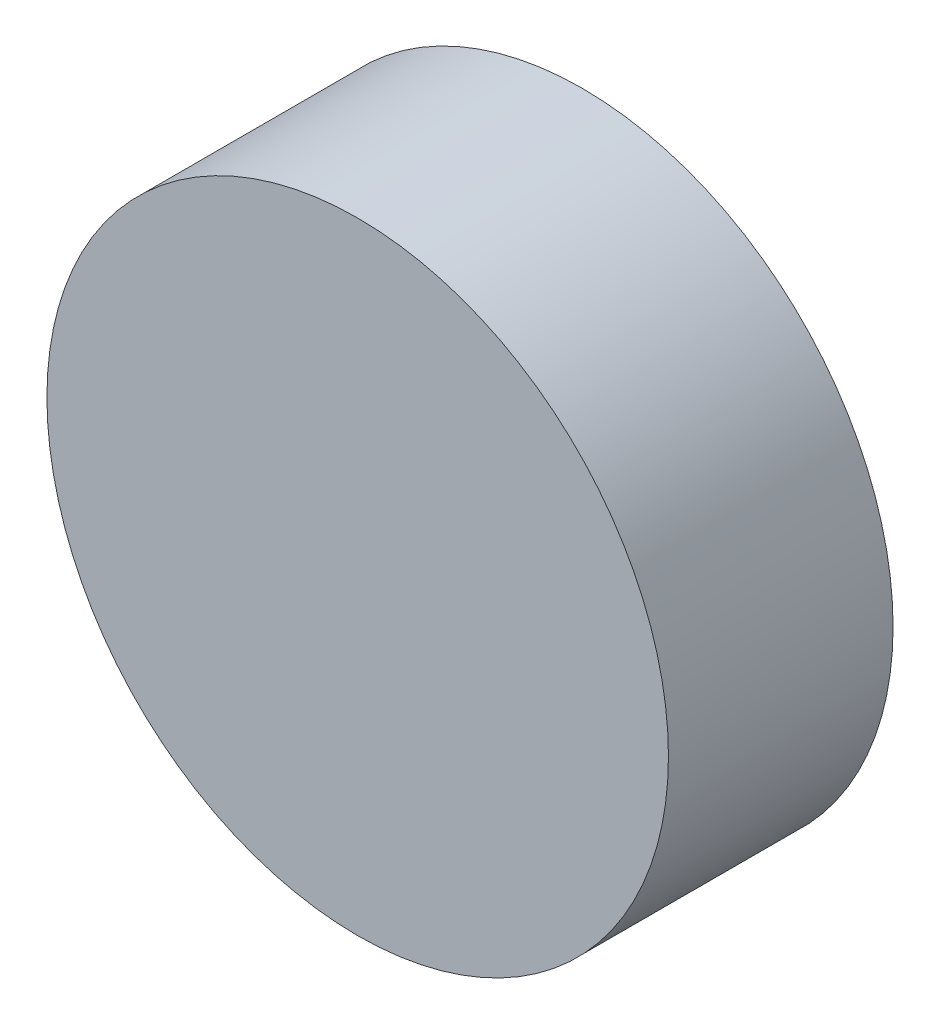
ISO-10303-21;
HEADER;
FILE_DESCRIPTION(('STEP AP214'),'2;1');
FILE_NAME('part.step','',(''),(''),'','','');
FILE_SCHEMA(('AUTOMOTIVE_DESIGN { 1 0 10303 214 1 1 1 1 }'));
ENDSEC;
DATA;
#1=APPLICATION_CONTEXT('core data for automotive mechanical design processes');
#2=APPLICATION_PROTOCOL_DEFINITION('international standard','automotive_design',2000,#1);
#3=PRODUCT_CONTEXT('',#1,'mechanical');
#4=PRODUCT('Part','Part','',(#3));
#5=PRODUCT_RELATED_PRODUCT_CATEGORY('part','',(#4));
#6=PRODUCT_DEFINITION_FORMATION('','',#4);
#7=PRODUCT_DEFINITION_CONTEXT('part definition',#1,'design');
#8=PRODUCT_DEFINITION('design','',#6,#7);
#9=PRODUCT_DEFINITION_SHAPE('','',#8);
#10=(LENGTH_UNIT() NAMED_UNIT(*) SI_UNIT(.MILLI.,.METRE.));
#11=(NAMED_UNIT(*) PLANE_ANGLE_UNIT() SI_UNIT($,.RADIAN.));
#12=(NAMED_UNIT(*) SI_UNIT($,.STERADIAN.) SOLID_ANGLE_UNIT());
#13=UNCERTAINTY_MEASURE_WITH_UNIT(LENGTH_MEASURE(1.E-05),#10,'distance_accuracy_value','');
#14=(GEOMETRIC_REPRESENTATION_CONTEXT(3) GLOBAL_UNCERTAINTY_ASSIGNED_CONTEXT((#13)) GLOBAL_UNIT_ASSIGNED_CONTEXT((#10,
#11,#12)) REPRESENTATION_CONTEXT('',''));
#15=CARTESIAN_POINT('',(0.,0.,0.));
#16=DIRECTION('',(0.,0.,1.));
#17=DIRECTION('',(1.,0.,0.));
#18=AXIS2_PLACEMENT_3D('',#15,#16,#17);
#19=CARTESIAN_POINT('',(0.,0.,18.07));
#20=DIRECTION('',(0.,0.,-1.));
#21=DIRECTION('',(-1.,0.,0.));
#22=AXIS2_PLACEMENT_3D('',#19,#20,#21);
#23=CYLINDRICAL_SURFACE('',#22,25.);
#24=CARTESIAN_POINT('',(0.,0.,18.07));
#25=DIRECTION('',(0.,0.,1.));
#26=DIRECTION('',(1.,0.,0.));
#27=AXIS2_PLACEMENT_3D('',#24,#25,#26);
#28=CIRCLE('',#27,25.);
#29=CARTESIAN_POINT('',(25.,0.,18.07));
#30=VERTEX_POINT('',#29);
#31=EDGE_CURVE('E10',#30,#30,#28,.T.);
#32=ORIENTED_EDGE('',*,*,#31,.F.);
#33=EDGE_LOOP('',(#32));
#34=FACE_BOUND('',#33,.T.);
#35=CARTESIAN_POINT('',(0.,0.,0.));
#36=DIRECTION('',(0.,0.,1.));
#37=DIRECTION('',(1.,0.,0.));
#38=AXIS2_PLACEMENT_3D('',#35,#36,#37);
#39=CIRCLE('',#38,25.);
#40=CARTESIAN_POINT('',(25.,0.,0.));
#41=VERTEX_POINT('',#40);
#42=EDGE_CURVE('E45',#41,#41,#39,.T.);
#43=ORIENTED_EDGE('',*,*,#42,.T.);
#44=EDGE_LOOP('',(#43));
#45=FACE_BOUND('',#44,.T.);
#46=ADVANCED_FACE('F39',(#34,#45),#23,.T.);
#47=CARTESIAN_POINT('',(0.,0.,18.07));
#48=DIRECTION('',(0.,0.,1.));
#49=DIRECTION('',(1.,0.,0.));
#50=AXIS2_PLACEMENT_3D('',#47,#48,#49);
#51=PLANE('',#50);
#52=ORIENTED_EDGE('',*,*,#31,.T.);
#53=EDGE_LOOP('',(#52));
#54=FACE_BOUND('',#53,.T.);
#55=ADVANCED_FACE('F53',(#54),#51,.T.);
#56=CARTESIAN_POINT('',(0.,0.,0.));
#57=DIRECTION('',(0.,0.,1.));
#58=DIRECTION('',(1.,0.,0.));
#59=AXIS2_PLACEMENT_3D('',#56,#57,#58);
#60=PLANE('',#59);
#61=ORIENTED_EDGE('',*,*,#42,.F.);
#62=EDGE_LOOP('',(#61));
#63=FACE_BOUND('',#62,.T.);
#64=ADVANCED_FACE('F55',(#63),#60,.F.);
#65=CLOSED_SHELL('',(#46,#55,#64));
#66=MANIFOLD_SOLID_BREP('B2',#65);
#67=ADVANCED_BREP_SHAPE_REPRESENTATION('',(#18,#66),#14);
#68=SHAPE_DEFINITION_REPRESENTATION(#9,#67);
ENDSEC;
END-ISO-10303-21;
